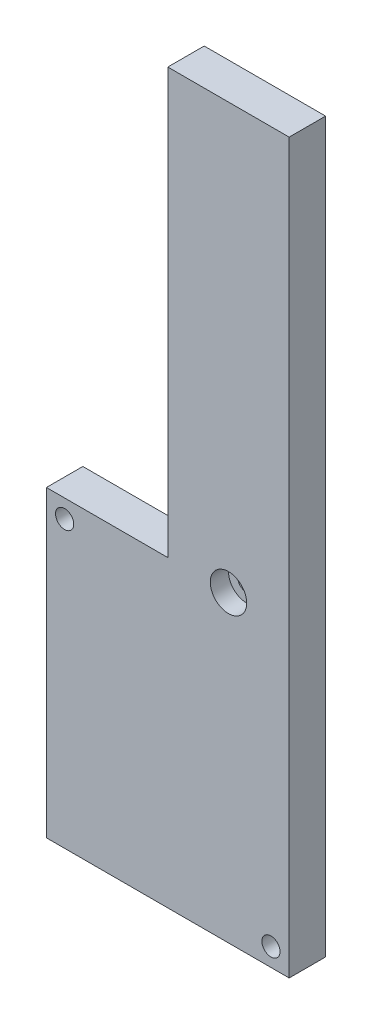
ISO-10303-21;
HEADER;
FILE_DESCRIPTION(('STEP AP214'),'2;1');
FILE_NAME('part.step','',(''),(''),'','','');
FILE_SCHEMA(('AUTOMOTIVE_DESIGN { 1 0 10303 214 1 1 1 1 }'));
ENDSEC;
DATA;
#1=APPLICATION_CONTEXT('core data for automotive mechanical design processes');
#2=APPLICATION_PROTOCOL_DEFINITION('international standard','automotive_design',2000,#1);
#3=PRODUCT_CONTEXT('',#1,'mechanical');
#4=PRODUCT('Part','Part','',(#3));
#5=PRODUCT_RELATED_PRODUCT_CATEGORY('part','',(#4));
#6=PRODUCT_DEFINITION_FORMATION('','',#4);
#7=PRODUCT_DEFINITION_CONTEXT('part definition',#1,'design');
#8=PRODUCT_DEFINITION('design','',#6,#7);
#9=PRODUCT_DEFINITION_SHAPE('','',#8);
#10=(LENGTH_UNIT() NAMED_UNIT(*) SI_UNIT(.MILLI.,.METRE.));
#11=(NAMED_UNIT(*) PLANE_ANGLE_UNIT() SI_UNIT($,.RADIAN.));
#12=(NAMED_UNIT(*) SI_UNIT($,.STERADIAN.) SOLID_ANGLE_UNIT());
#13=UNCERTAINTY_MEASURE_WITH_UNIT(LENGTH_MEASURE(1.E-05),#10,'distance_accuracy_value','');
#14=(GEOMETRIC_REPRESENTATION_CONTEXT(3) GLOBAL_UNCERTAINTY_ASSIGNED_CONTEXT((#13)) GLOBAL_UNIT_ASSIGNED_CONTEXT((#10,
#11,#12)) REPRESENTATION_CONTEXT('',''));
#15=CARTESIAN_POINT('',(0.,0.,0.));
#16=DIRECTION('',(0.,0.,1.));
#17=DIRECTION('',(1.,0.,0.));
#18=AXIS2_PLACEMENT_3D('',#15,#16,#17);
#19=CARTESIAN_POINT('',(30.,50.,0.));
#20=DIRECTION('',(0.,0.,1.));
#21=DIRECTION('',(1.,0.,0.));
#22=AXIS2_PLACEMENT_3D('',#19,#20,#21);
#23=CYLINDRICAL_SURFACE('',#22,1.5);
#24=CARTESIAN_POINT('',(30.,50.,0.));
#25=DIRECTION('',(0.,0.,1.));
#26=DIRECTION('',(1.,0.,0.));
#27=AXIS2_PLACEMENT_3D('',#24,#25,#26);
#28=CIRCLE('',#27,1.5);
#29=CARTESIAN_POINT('',(31.5,50.,0.));
#30=VERTEX_POINT('',#29);
#31=EDGE_CURVE('E155',#30,#30,#28,.T.);
#32=ORIENTED_EDGE('',*,*,#31,.F.);
#33=EDGE_LOOP('',(#32));
#34=FACE_BOUND('',#33,.T.);
#35=CARTESIAN_POINT('',(30.,50.,3.));
#36=DIRECTION('',(0.,0.,1.));
#37=DIRECTION('',(1.,0.,0.));
#38=AXIS2_PLACEMENT_3D('',#35,#36,#37);
#39=CIRCLE('',#38,1.5);
#40=CARTESIAN_POINT('',(31.5,50.,3.));
#41=VERTEX_POINT('',#40);
#42=EDGE_CURVE('E37',#41,#41,#39,.F.);
#43=ORIENTED_EDGE('',*,*,#42,.F.);
#44=EDGE_LOOP('',(#43));
#45=FACE_BOUND('',#44,.T.);
#46=ADVANCED_FACE('F33',(#34,#45),#23,.F.);
#47=CARTESIAN_POINT('',(0.,0.,6.));
#48=DIRECTION('',(1.,0.,0.));
#49=DIRECTION('',(0.,0.,-1.));
#50=AXIS2_PLACEMENT_3D('',#47,#48,#49);
#51=PLANE('',#50);
#52=DIRECTION('',(0.,-1.,0.));
#53=VECTOR('',#52,1.);
#54=CARTESIAN_POINT('',(0.,0.,6.));
#55=LINE('',#54,#53);
#56=CARTESIAN_POINT('',(0.,50.,6.));
#57=VERTEX_POINT('',#56);
#58=CARTESIAN_POINT('',(0.,0.,6.));
#59=VERTEX_POINT('',#58);
#60=EDGE_CURVE('E80',#57,#59,#55,.T.);
#61=ORIENTED_EDGE('',*,*,#60,.F.);
#62=DIRECTION('',(0.,0.,1.));
#63=VECTOR('',#62,1.);
#64=CARTESIAN_POINT('',(0.,50.,0.));
#65=LINE('',#64,#63);
#66=CARTESIAN_POINT('',(0.,50.,0.));
#67=VERTEX_POINT('',#66);
#68=EDGE_CURVE('E100',#67,#57,#65,.T.);
#69=ORIENTED_EDGE('',*,*,#68,.F.);
#70=DIRECTION('',(0.,-1.,0.));
#71=VECTOR('',#70,1.);
#72=CARTESIAN_POINT('',(0.,0.,0.));
#73=LINE('',#72,#71);
#74=CARTESIAN_POINT('',(0.,0.,0.));
#75=VERTEX_POINT('',#74);
#76=EDGE_CURVE('E108',#67,#75,#73,.T.);
#77=ORIENTED_EDGE('',*,*,#76,.T.);
#78=DIRECTION('',(0.,0.,-1.));
#79=VECTOR('',#78,1.);
#80=CARTESIAN_POINT('',(0.,0.,6.));
#81=LINE('',#80,#79);
#82=EDGE_CURVE('E11',#59,#75,#81,.T.);
#83=ORIENTED_EDGE('',*,*,#82,.F.);
#84=EDGE_LOOP('',(#61,#69,#77,#83));
#85=FACE_BOUND('',#84,.T.);
#86=ADVANCED_FACE('F35',(#85),#51,.F.);
#87=CARTESIAN_POINT('',(0.,0.,6.));
#88=DIRECTION('',(0.,1.,0.));
#89=DIRECTION('',(0.,0.,1.));
#90=AXIS2_PLACEMENT_3D('',#87,#88,#89);
#91=PLANE('',#90);
#92=DIRECTION('',(1.,0.,0.));
#93=VECTOR('',#92,1.);
#94=CARTESIAN_POINT('',(0.,0.,0.));
#95=LINE('',#94,#93);
#96=CARTESIAN_POINT('',(40.,0.,0.));
#97=VERTEX_POINT('',#96);
#98=EDGE_CURVE('E112',#75,#97,#95,.T.);
#99=ORIENTED_EDGE('',*,*,#98,.T.);
#100=DIRECTION('',(0.,0.,-1.));
#101=VECTOR('',#100,1.);
#102=CARTESIAN_POINT('',(40.,0.,6.));
#103=LINE('',#102,#101);
#104=CARTESIAN_POINT('',(40.,0.,6.));
#105=VERTEX_POINT('',#104);
#106=EDGE_CURVE('E42',#105,#97,#103,.T.);
#107=ORIENTED_EDGE('',*,*,#106,.F.);
#108=DIRECTION('',(1.,0.,0.));
#109=VECTOR('',#108,1.);
#110=CARTESIAN_POINT('',(0.,0.,6.));
#111=LINE('',#110,#109);
#112=EDGE_CURVE('E136',#59,#105,#111,.T.);
#113=ORIENTED_EDGE('',*,*,#112,.F.);
#114=ORIENTED_EDGE('',*,*,#82,.T.);
#115=EDGE_LOOP('',(#99,#107,#113,#114));
#116=FACE_BOUND('',#115,.T.);
#117=ADVANCED_FACE('F178',(#116),#91,.F.);
#118=CARTESIAN_POINT('',(40.,0.,6.));
#119=DIRECTION('',(-1.,0.,0.));
#120=DIRECTION('',(0.,0.,1.));
#121=AXIS2_PLACEMENT_3D('',#118,#119,#120);
#122=PLANE('',#121);
#123=DIRECTION('',(0.,1.,0.));
#124=VECTOR('',#123,1.);
#125=CARTESIAN_POINT('',(40.,0.,0.));
#126=LINE('',#125,#124);
#127=CARTESIAN_POINT('',(40.,120.,0.));
#128=VERTEX_POINT('',#127);
#129=EDGE_CURVE('E75',#97,#128,#126,.T.);
#130=ORIENTED_EDGE('',*,*,#129,.T.);
#131=DIRECTION('',(0.,0.,-1.));
#132=VECTOR('',#131,1.);
#133=CARTESIAN_POINT('',(40.,120.,6.));
#134=LINE('',#133,#132);
#135=CARTESIAN_POINT('',(40.,120.,6.));
#136=VERTEX_POINT('',#135);
#137=EDGE_CURVE('E126',#136,#128,#134,.T.);
#138=ORIENTED_EDGE('',*,*,#137,.F.);
#139=DIRECTION('',(0.,1.,0.));
#140=VECTOR('',#139,1.);
#141=CARTESIAN_POINT('',(40.,0.,6.));
#142=LINE('',#141,#140);
#143=EDGE_CURVE('E58',#105,#136,#142,.T.);
#144=ORIENTED_EDGE('',*,*,#143,.F.);
#145=ORIENTED_EDGE('',*,*,#106,.T.);
#146=EDGE_LOOP('',(#130,#138,#144,#145));
#147=FACE_BOUND('',#146,.T.);
#148=ADVANCED_FACE('F129',(#147),#122,.F.);
#149=CARTESIAN_POINT('',(0.,120.,6.));
#150=DIRECTION('',(0.,-1.,0.));
#151=DIRECTION('',(0.,0.,-1.));
#152=AXIS2_PLACEMENT_3D('',#149,#150,#151);
#153=PLANE('',#152);
#154=DIRECTION('',(-1.,0.,0.));
#155=VECTOR('',#154,1.);
#156=CARTESIAN_POINT('',(0.,120.,0.));
#157=LINE('',#156,#155);
#158=CARTESIAN_POINT('',(20.,120.,0.));
#159=VERTEX_POINT('',#158);
#160=EDGE_CURVE('E123',#128,#159,#157,.T.);
#161=ORIENTED_EDGE('',*,*,#160,.T.);
#162=DIRECTION('',(0.,0.,1.));
#163=VECTOR('',#162,1.);
#164=CARTESIAN_POINT('',(20.,120.,0.));
#165=LINE('',#164,#163);
#166=CARTESIAN_POINT('',(20.,120.,6.));
#167=VERTEX_POINT('',#166);
#168=EDGE_CURVE('E113',#159,#167,#165,.T.);
#169=ORIENTED_EDGE('',*,*,#168,.T.);
#170=DIRECTION('',(-1.,0.,0.));
#171=VECTOR('',#170,1.);
#172=CARTESIAN_POINT('',(0.,120.,6.));
#173=LINE('',#172,#171);
#174=EDGE_CURVE('E119',#136,#167,#173,.T.);
#175=ORIENTED_EDGE('',*,*,#174,.F.);
#176=ORIENTED_EDGE('',*,*,#137,.T.);
#177=EDGE_LOOP('',(#161,#169,#175,#176));
#178=FACE_BOUND('',#177,.T.);
#179=ADVANCED_FACE('F133',(#178),#153,.F.);
#180=CARTESIAN_POINT('',(0.,0.,6.));
#181=DIRECTION('',(0.,0.,-1.));
#182=DIRECTION('',(-1.,0.,0.));
#183=AXIS2_PLACEMENT_3D('',#180,#181,#182);
#184=PLANE('',#183);
#185=CARTESIAN_POINT('',(30.,50.,6.));
#186=DIRECTION('',(0.,0.,1.));
#187=DIRECTION('',(1.,0.,0.));
#188=AXIS2_PLACEMENT_3D('',#185,#186,#187);
#189=CIRCLE('',#188,3.);
#190=CARTESIAN_POINT('',(33.,50.,6.));
#191=VERTEX_POINT('',#190);
#192=EDGE_CURVE('E160',#191,#191,#189,.T.);
#193=ORIENTED_EDGE('',*,*,#192,.F.);
#194=EDGE_LOOP('',(#193));
#195=FACE_BOUND('',#194,.T.);
#196=CARTESIAN_POINT('',(37.,3.,6.));
#197=DIRECTION('',(0.,0.,1.));
#198=DIRECTION('',(1.,0.,0.));
#199=AXIS2_PLACEMENT_3D('',#196,#197,#198);
#200=CIRCLE('',#199,1.5);
#201=CARTESIAN_POINT('',(38.5,3.,6.));
#202=VERTEX_POINT('',#201);
#203=EDGE_CURVE('E152',#202,#202,#200,.T.);
#204=ORIENTED_EDGE('',*,*,#203,.F.);
#205=EDGE_LOOP('',(#204));
#206=FACE_BOUND('',#205,.T.);
#207=CARTESIAN_POINT('',(3.00000000000001,47.,6.));
#208=DIRECTION('',(0.,0.,1.));
#209=DIRECTION('',(1.,0.,0.));
#210=AXIS2_PLACEMENT_3D('',#207,#208,#209);
#211=CIRCLE('',#210,1.5);
#212=CARTESIAN_POINT('',(4.50000000000001,47.,6.));
#213=VERTEX_POINT('',#212);
#214=EDGE_CURVE('E146',#213,#213,#211,.T.);
#215=ORIENTED_EDGE('',*,*,#214,.F.);
#216=EDGE_LOOP('',(#215));
#217=FACE_BOUND('',#216,.T.);
#218=ORIENTED_EDGE('',*,*,#174,.T.);
#219=DIRECTION('',(0.,1.,0.));
#220=VECTOR('',#219,1.);
#221=CARTESIAN_POINT('',(20.,120.,6.));
#222=LINE('',#221,#220);
#223=CARTESIAN_POINT('',(20.,50.,6.));
#224=VERTEX_POINT('',#223);
#225=EDGE_CURVE('E104',#224,#167,#222,.T.);
#226=ORIENTED_EDGE('',*,*,#225,.F.);
#227=DIRECTION('',(1.,0.,0.));
#228=VECTOR('',#227,1.);
#229=CARTESIAN_POINT('',(0.,50.,6.));
#230=LINE('',#229,#228);
#231=EDGE_CURVE('E142',#57,#224,#230,.T.);
#232=ORIENTED_EDGE('',*,*,#231,.F.);
#233=ORIENTED_EDGE('',*,*,#60,.T.);
#234=ORIENTED_EDGE('',*,*,#112,.T.);
#235=ORIENTED_EDGE('',*,*,#143,.T.);
#236=EDGE_LOOP('',(#218,#226,#232,#233,#234,#235));
#237=FACE_BOUND('',#236,.T.);
#238=ADVANCED_FACE('F197',(#195,#206,#217,#237),#184,.F.);
#239=CARTESIAN_POINT('',(0.,0.,0.));
#240=DIRECTION('',(0.,0.,-1.));
#241=DIRECTION('',(-1.,0.,0.));
#242=AXIS2_PLACEMENT_3D('',#239,#240,#241);
#243=PLANE('',#242);
#244=ORIENTED_EDGE('',*,*,#31,.T.);
#245=EDGE_LOOP('',(#244));
#246=FACE_BOUND('',#245,.T.);
#247=CARTESIAN_POINT('',(37.,3.,0.));
#248=DIRECTION('',(0.,0.,1.));
#249=DIRECTION('',(1.,0.,0.));
#250=AXIS2_PLACEMENT_3D('',#247,#248,#249);
#251=CIRCLE('',#250,1.5);
#252=CARTESIAN_POINT('',(38.5,3.,0.));
#253=VERTEX_POINT('',#252);
#254=EDGE_CURVE('E149',#253,#253,#251,.T.);
#255=ORIENTED_EDGE('',*,*,#254,.T.);
#256=EDGE_LOOP('',(#255));
#257=FACE_BOUND('',#256,.T.);
#258=CARTESIAN_POINT('',(3.00000000000001,47.,0.));
#259=DIRECTION('',(0.,0.,1.));
#260=DIRECTION('',(1.,0.,0.));
#261=AXIS2_PLACEMENT_3D('',#258,#259,#260);
#262=CIRCLE('',#261,1.5);
#263=CARTESIAN_POINT('',(4.50000000000001,47.,0.));
#264=VERTEX_POINT('',#263);
#265=EDGE_CURVE('E144',#264,#264,#262,.T.);
#266=ORIENTED_EDGE('',*,*,#265,.T.);
#267=EDGE_LOOP('',(#266));
#268=FACE_BOUND('',#267,.T.);
#269=DIRECTION('',(0.,1.,0.));
#270=VECTOR('',#269,1.);
#271=CARTESIAN_POINT('',(20.,120.,0.));
#272=LINE('',#271,#270);
#273=CARTESIAN_POINT('',(20.,50.,0.));
#274=VERTEX_POINT('',#273);
#275=EDGE_CURVE('E49',#274,#159,#272,.T.);
#276=ORIENTED_EDGE('',*,*,#275,.T.);
#277=ORIENTED_EDGE('',*,*,#160,.F.);
#278=ORIENTED_EDGE('',*,*,#129,.F.);
#279=ORIENTED_EDGE('',*,*,#98,.F.);
#280=ORIENTED_EDGE('',*,*,#76,.F.);
#281=DIRECTION('',(1.,0.,0.));
#282=VECTOR('',#281,1.);
#283=CARTESIAN_POINT('',(0.,50.,0.));
#284=LINE('',#283,#282);
#285=EDGE_CURVE('E96',#67,#274,#284,.T.);
#286=ORIENTED_EDGE('',*,*,#285,.T.);
#287=EDGE_LOOP('',(#276,#277,#278,#279,#280,#286));
#288=FACE_BOUND('',#287,.T.);
#289=ADVANCED_FACE('F111',(#246,#257,#268,#288),#243,.T.);
#290=CARTESIAN_POINT('',(20.,120.,0.));
#291=DIRECTION('',(1.,0.,0.));
#292=DIRECTION('',(0.,1.,0.));
#293=AXIS2_PLACEMENT_3D('',#290,#291,#292);
#294=PLANE('',#293);
#295=ORIENTED_EDGE('',*,*,#225,.T.);
#296=ORIENTED_EDGE('',*,*,#168,.F.);
#297=ORIENTED_EDGE('',*,*,#275,.F.);
#298=DIRECTION('',(0.,0.,1.));
#299=VECTOR('',#298,1.);
#300=CARTESIAN_POINT('',(20.,50.,0.));
#301=LINE('',#300,#299);
#302=EDGE_CURVE('E101',#274,#224,#301,.T.);
#303=ORIENTED_EDGE('',*,*,#302,.T.);
#304=EDGE_LOOP('',(#295,#296,#297,#303));
#305=FACE_BOUND('',#304,.T.);
#306=ADVANCED_FACE('F192',(#305),#294,.F.);
#307=CARTESIAN_POINT('',(0.,50.,0.));
#308=DIRECTION('',(0.,-1.,0.));
#309=DIRECTION('',(0.,0.,-1.));
#310=AXIS2_PLACEMENT_3D('',#307,#308,#309);
#311=PLANE('',#310);
#312=ORIENTED_EDGE('',*,*,#231,.T.);
#313=ORIENTED_EDGE('',*,*,#302,.F.);
#314=ORIENTED_EDGE('',*,*,#285,.F.);
#315=ORIENTED_EDGE('',*,*,#68,.T.);
#316=EDGE_LOOP('',(#312,#313,#314,#315));
#317=FACE_BOUND('',#316,.T.);
#318=ADVANCED_FACE('F99',(#317),#311,.F.);
#319=CARTESIAN_POINT('',(3.00000000000001,47.,0.));
#320=DIRECTION('',(0.,0.,1.));
#321=DIRECTION('',(1.,0.,0.));
#322=AXIS2_PLACEMENT_3D('',#319,#320,#321);
#323=CYLINDRICAL_SURFACE('',#322,1.5);
#324=ORIENTED_EDGE('',*,*,#265,.F.);
#325=EDGE_LOOP('',(#324));
#326=FACE_BOUND('',#325,.T.);
#327=ORIENTED_EDGE('',*,*,#214,.T.);
#328=EDGE_LOOP('',(#327));
#329=FACE_BOUND('',#328,.T.);
#330=ADVANCED_FACE('F187',(#326,#329),#323,.F.);
#331=CARTESIAN_POINT('',(37.,3.,0.));
#332=DIRECTION('',(0.,0.,1.));
#333=DIRECTION('',(1.,0.,0.));
#334=AXIS2_PLACEMENT_3D('',#331,#332,#333);
#335=CYLINDRICAL_SURFACE('',#334,1.5);
#336=ORIENTED_EDGE('',*,*,#254,.F.);
#337=EDGE_LOOP('',(#336));
#338=FACE_BOUND('',#337,.T.);
#339=ORIENTED_EDGE('',*,*,#203,.T.);
#340=EDGE_LOOP('',(#339));
#341=FACE_BOUND('',#340,.T.);
#342=ADVANCED_FACE('F184',(#338,#341),#335,.F.);
#343=CARTESIAN_POINT('',(30.,50.,3.));
#344=DIRECTION('',(0.,0.,1.));
#345=DIRECTION('',(1.,0.,0.));
#346=AXIS2_PLACEMENT_3D('',#343,#344,#345);
#347=PLANE('',#346);
#348=CARTESIAN_POINT('',(30.,50.,3.));
#349=DIRECTION('',(0.,0.,1.));
#350=DIRECTION('',(1.,0.,0.));
#351=AXIS2_PLACEMENT_3D('',#348,#349,#350);
#352=CIRCLE('',#351,3.);
#353=CARTESIAN_POINT('',(33.,50.,3.));
#354=VERTEX_POINT('',#353);
#355=EDGE_CURVE('E163',#354,#354,#352,.T.);
#356=ORIENTED_EDGE('',*,*,#355,.T.);
#357=EDGE_LOOP('',(#356));
#358=FACE_BOUND('',#357,.T.);
#359=ORIENTED_EDGE('',*,*,#42,.T.);
#360=EDGE_LOOP('',(#359));
#361=FACE_BOUND('',#360,.T.);
#362=ADVANCED_FACE('F170',(#358,#361),#347,.T.);
#363=CARTESIAN_POINT('',(30.,50.,3.));
#364=DIRECTION('',(0.,0.,1.));
#365=DIRECTION('',(1.,0.,0.));
#366=AXIS2_PLACEMENT_3D('',#363,#364,#365);
#367=CYLINDRICAL_SURFACE('',#366,3.);
#368=ORIENTED_EDGE('',*,*,#355,.F.);
#369=EDGE_LOOP('',(#368));
#370=FACE_BOUND('',#369,.T.);
#371=ORIENTED_EDGE('',*,*,#192,.T.);
#372=EDGE_LOOP('',(#371));
#373=FACE_BOUND('',#372,.T.);
#374=ADVANCED_FACE('F182',(#370,#373),#367,.F.);
#375=CLOSED_SHELL('',(#46,#86,#117,#148,#179,#238,#289,#306,#318,#330,#342,#362,#374));
#376=MANIFOLD_SOLID_BREP('B2',#375);
#377=ADVANCED_BREP_SHAPE_REPRESENTATION('',(#18,#376),#14);
#378=SHAPE_DEFINITION_REPRESENTATION(#9,#377);
ENDSEC;
END-ISO-10303-21;
